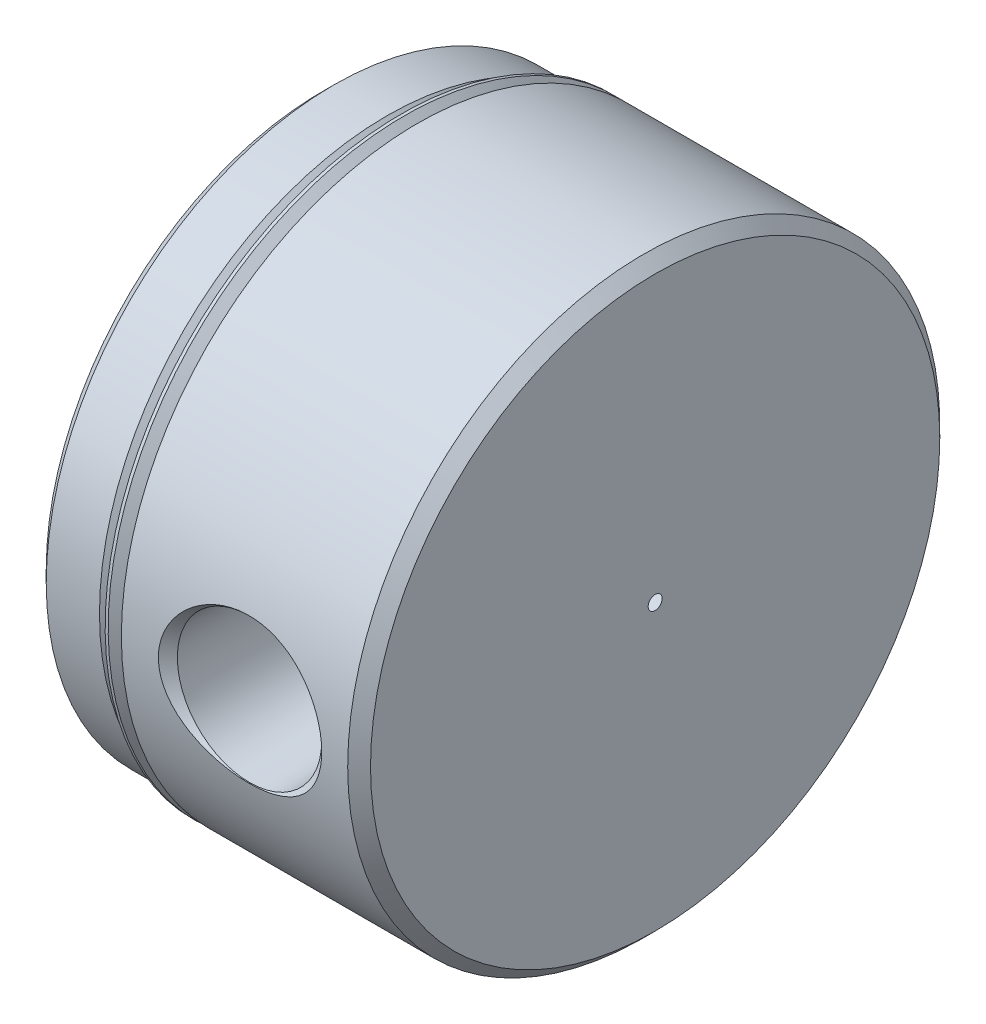
ISO-10303-21;
HEADER;
FILE_DESCRIPTION(('STEP AP214'),'2;1');
FILE_NAME('part.step','',(''),(''),'','','');
FILE_SCHEMA(('AUTOMOTIVE_DESIGN { 1 0 10303 214 1 1 1 1 }'));
ENDSEC;
DATA;
#1=APPLICATION_CONTEXT('core data for automotive mechanical design processes');
#2=APPLICATION_PROTOCOL_DEFINITION('international standard','automotive_design',2000,#1);
#3=PRODUCT_CONTEXT('',#1,'mechanical');
#4=PRODUCT('Part','Part','',(#3));
#5=PRODUCT_RELATED_PRODUCT_CATEGORY('part','',(#4));
#6=PRODUCT_DEFINITION_FORMATION('','',#4);
#7=PRODUCT_DEFINITION_CONTEXT('part definition',#1,'design');
#8=PRODUCT_DEFINITION('design','',#6,#7);
#9=PRODUCT_DEFINITION_SHAPE('','',#8);
#10=(LENGTH_UNIT() NAMED_UNIT(*) SI_UNIT(.MILLI.,.METRE.));
#11=(NAMED_UNIT(*) PLANE_ANGLE_UNIT() SI_UNIT($,.RADIAN.));
#12=(NAMED_UNIT(*) SI_UNIT($,.STERADIAN.) SOLID_ANGLE_UNIT());
#13=UNCERTAINTY_MEASURE_WITH_UNIT(LENGTH_MEASURE(1.E-05),#10,'distance_accuracy_value','');
#14=(GEOMETRIC_REPRESENTATION_CONTEXT(3) GLOBAL_UNCERTAINTY_ASSIGNED_CONTEXT((#13)) GLOBAL_UNIT_ASSIGNED_CONTEXT((#10,
#11,#12)) REPRESENTATION_CONTEXT('',''));
#15=CARTESIAN_POINT('',(0.,0.,0.));
#16=DIRECTION('',(0.,0.,1.));
#17=DIRECTION('',(1.,0.,0.));
#18=AXIS2_PLACEMENT_3D('',#15,#16,#17);
#19=CARTESIAN_POINT('',(22.225,0.,0.));
#20=DIRECTION('',(-1.,0.,0.));
#21=DIRECTION('',(0.,0.,1.));
#22=AXIS2_PLACEMENT_3D('',#19,#20,#21);
#23=CYLINDRICAL_SURFACE('',#22,18.18005);
#24=CARTESIAN_POINT('',(5.334,0.,0.));
#25=DIRECTION('',(-1.,0.,0.));
#26=DIRECTION('',(0.,0.,1.));
#27=AXIS2_PLACEMENT_3D('',#24,#25,#26);
#28=CIRCLE('',#27,18.18005);
#29=CARTESIAN_POINT('',(5.334,0.,18.18005));
#30=VERTEX_POINT('',#29);
#31=EDGE_CURVE('E91',#30,#30,#28,.T.);
#32=ORIENTED_EDGE('',*,*,#31,.F.);
#33=EDGE_LOOP('',(#32));
#34=FACE_BOUND('',#33,.T.);
#35=CARTESIAN_POINT('',(5.84200000000007,0.,0.));
#36=DIRECTION('',(1.,0.,0.));
#37=DIRECTION('',(0.,1.,0.));
#38=AXIS2_PLACEMENT_3D('',#35,#36,#37);
#39=CIRCLE('',#38,18.18005);
#40=CARTESIAN_POINT('',(5.84199999999987,18.1800500000001,0.));
#41=VERTEX_POINT('',#40);
#42=EDGE_CURVE('E11',#41,#41,#39,.T.);
#43=ORIENTED_EDGE('',*,*,#42,.F.);
#44=EDGE_LOOP('',(#43));
#45=FACE_BOUND('',#44,.T.);
#46=ADVANCED_FACE('F40',(#34,#45),#23,.T.);
#47=CARTESIAN_POINT('',(6.35,18.18005,0.));
#48=DIRECTION('',(1.,0.,0.));
#49=DIRECTION('',(0.,0.,-1.));
#50=AXIS2_PLACEMENT_3D('',#47,#48,#49);
#51=PLANE('',#50);
#52=CARTESIAN_POINT('',(6.35,0.,0.));
#53=DIRECTION('',(-1.,0.,0.));
#54=DIRECTION('',(0.,0.,1.));
#55=AXIS2_PLACEMENT_3D('',#52,#53,#54);
#56=CIRCLE('',#55,19.76755);
#57=CARTESIAN_POINT('',(6.35,0.,19.76755));
#58=VERTEX_POINT('',#57);
#59=EDGE_CURVE('E88',#58,#58,#56,.T.);
#60=ORIENTED_EDGE('',*,*,#59,.T.);
#61=EDGE_LOOP('',(#60));
#62=FACE_BOUND('',#61,.T.);
#63=CARTESIAN_POINT('',(6.35,0.,-2.09701802314513E-13));
#64=DIRECTION('',(1.,0.,0.));
#65=DIRECTION('',(0.,0.,-1.));
#66=AXIS2_PLACEMENT_3D('',#63,#64,#65);
#67=CIRCLE('',#66,18.8882591752451);
#68=CARTESIAN_POINT('',(6.35,0.,-18.8882591752453));
#69=VERTEX_POINT('',#68);
#70=EDGE_CURVE('E48',#69,#69,#67,.F.);
#71=ORIENTED_EDGE('',*,*,#70,.F.);
#72=EDGE_LOOP('',(#71));
#73=FACE_BOUND('',#72,.T.);
#74=ADVANCED_FACE('F162',(#62,#73),#51,.F.);
#75=CARTESIAN_POINT('',(0.,0.,0.));
#76=DIRECTION('',(-1.,0.,0.));
#77=DIRECTION('',(0.,0.,1.));
#78=AXIS2_PLACEMENT_3D('',#75,#76,#77);
#79=CYLINDRICAL_SURFACE('',#78,6.7564);
#80=CARTESIAN_POINT('',(18.5928000000002,-1.55016936318018,6.57616270369412));
#81=CARTESIAN_POINT('',(18.5480783546021,-1.67477017407394,6.54681110042799));
#82=CARTESIAN_POINT('',(18.4982069019602,-1.79670416096938,6.51431130142337));
#83=CARTESIAN_POINT('',(18.3889398911797,-2.034471868403,6.44400086646078));
#84=CARTESIAN_POINT('',(18.3295545154926,-2.15031193694006,6.40619591374911));
#85=CARTESIAN_POINT('',(18.2022291765273,-2.37487755976104,6.32637743122827));
#86=CARTESIAN_POINT('',(18.1343296276472,-2.48363326109138,6.28438396405489));
#87=CARTESIAN_POINT('',(17.9904073482674,-2.69419408425629,6.19703694181793));
#88=CARTESIAN_POINT('',(17.9143824575952,-2.79599734589265,6.15168249420449));
#89=CARTESIAN_POINT('',(17.6756516881527,-3.08962890373542,6.01247195430659));
#90=CARTESIAN_POINT('',(17.5016575906913,-3.27078021296364,5.91506016042606));
#91=CARTESIAN_POINT('',(17.1266794554601,-3.60246884588408,5.71912272723389));
#92=CARTESIAN_POINT('',(16.925648520464,-3.75295180614472,5.62059543122973));
#93=CARTESIAN_POINT('',(16.5170575522464,-4.00917287001961,5.44038937728638));
#94=CARTESIAN_POINT('',(16.3115382567099,-4.11764256855379,5.35799033818033));
#95=CARTESIAN_POINT('',(15.8815253629173,-4.30362633415061,5.20979058670521));
#96=CARTESIAN_POINT('',(15.6570736802124,-4.38120671660834,5.14395442913646));
#97=CARTESIAN_POINT('',(15.2384723544777,-4.48960836666032,5.04940736413939));
#98=CARTESIAN_POINT('',(15.0470252632443,-4.52661952298427,5.01594531152541));
#99=CARTESIAN_POINT('',(14.6585033498917,-4.57593097078118,4.97101309444454));
#100=CARTESIAN_POINT('',(14.4614353487014,-4.58826001958046,4.95951733757795));
#101=CARTESIAN_POINT('',(14.0671575987921,-4.5873682960647,4.9603419785027));
#102=CARTESIAN_POINT('',(13.8699479902141,-4.57411489152293,4.97269279428765));
#103=CARTESIAN_POINT('',(13.481314727699,-4.5229497040564,5.01926294086608));
#104=CARTESIAN_POINT('',(13.2898991557438,-4.48500500139721,5.05351146577056));
#105=CARTESIAN_POINT('',(12.8694089990069,-4.37397590414582,5.15013858421322));
#106=CARTESIAN_POINT('',(12.6432173725713,-4.29438795650013,5.21747027846388));
#107=CARTESIAN_POINT('',(12.2103737994155,-4.10395208742262,5.36854163197956));
#108=CARTESIAN_POINT('',(12.0037506235077,-3.99305906365896,5.45230491129153));
#109=CARTESIAN_POINT('',(11.6078690502403,-3.74056673260752,5.62861592264111));
#110=CARTESIAN_POINT('',(11.4190397789097,-3.5983984964746,5.72130566468947));
#111=CARTESIAN_POINT('',(11.0650148013139,-3.28649474473922,5.90599018926294));
#112=CARTESIAN_POINT('',(10.8998284149905,-3.11674841393698,5.99798468426317));
#113=CARTESIAN_POINT('',(10.6590781037533,-2.82736759192116,6.13751100490684));
#114=CARTESIAN_POINT('',(10.5747637703954,-2.71615917843616,6.18765532662777));
#115=CARTESIAN_POINT('',(10.4159373046059,-2.48534476456429,6.28391717198707));
#116=CARTESIAN_POINT('',(10.3414208431729,-2.36574250890419,6.33003647095517));
#117=CARTESIAN_POINT('',(10.203089686097,-2.11880193024189,6.41690924360146));
#118=CARTESIAN_POINT('',(10.1392642692946,-1.99147153389607,6.45766808391518));
#119=CARTESIAN_POINT('',(10.0231886128704,-1.72986685829916,6.5326130675245));
#120=CARTESIAN_POINT('',(9.97093371528921,-1.5955954002702,6.56680185499996));
#121=CARTESIAN_POINT('',(9.85653287360742,-1.25429314337887,6.64222801271814));
#122=CARTESIAN_POINT('',(9.80191452573611,-1.04360474104496,6.67882070242641));
#123=CARTESIAN_POINT('',(9.72305551227294,-0.614300653156337,6.73188821156131));
#124=CARTESIAN_POINT('',(9.69879054988074,-0.395691452347844,6.74837912147382));
#125=CARTESIAN_POINT('',(9.68191036515892,0.0437172497495764,6.75983608394331));
#126=CARTESIAN_POINT('',(9.68934887987925,0.264519836488323,6.75476559018812));
#127=CARTESIAN_POINT('',(9.73557020819385,0.701293032369471,6.72347499875372));
#128=CARTESIAN_POINT('',(9.77436235112002,0.917262183654551,6.69724860610096));
#129=CARTESIAN_POINT('',(9.88020681646112,1.3346340565651,6.62659243989054));
#130=CARTESIAN_POINT('',(9.94673313635791,1.53623008207218,6.5825018917664));
#131=CARTESIAN_POINT('',(10.1051010047477,1.92506615557765,6.47947315861717));
#132=CARTESIAN_POINT('',(10.196947371199,2.1123034626896,6.42053214799483));
#133=CARTESIAN_POINT('',(10.4146617279391,2.49002673443004,6.28437947384145));
#134=CARTESIAN_POINT('',(10.5431998940954,2.67849332151466,6.20585639742187));
#135=CARTESIAN_POINT('',(10.8246521487988,3.03246917966281,6.04080320131233));
#136=CARTESIAN_POINT('',(10.9775944415059,3.19795146844978,5.95426386627355));
#137=CARTESIAN_POINT('',(11.333106600818,3.53036100364397,5.76437277869107));
#138=CARTESIAN_POINT('',(11.5396951051159,3.69279989815421,5.66065279573348));
#139=CARTESIAN_POINT('',(11.9803196741159,3.98156448888008,5.46139266085853));
#140=CARTESIAN_POINT('',(12.2143404876726,4.10791011831174,5.36584801445409));
#141=CARTESIAN_POINT('',(12.6490198095501,4.29496946517335,5.21660723679697));
#142=CARTESIAN_POINT('',(12.8444067120639,4.36414371087455,5.15836116778382));
#143=CARTESIAN_POINT('',(13.1463316164498,4.44810420733218,5.08573184568603));
#144=CARTESIAN_POINT('',(13.2484115175242,4.47278591721943,5.0639835421401));
#145=CARTESIAN_POINT('',(13.455017349472,4.51521988935389,5.02618570643374));
#146=CARTESIAN_POINT('',(13.5595421189191,4.53297537375789,5.0101335246891));
#147=CARTESIAN_POINT('',(13.7712614652903,4.56137080114024,4.98429650223126));
#148=CARTESIAN_POINT('',(13.8784712968326,4.57194802438945,4.97456693557593));
#149=CARTESIAN_POINT('',(14.0937773748546,4.58552224102421,4.962057349779));
#150=CARTESIAN_POINT('',(14.2018736035466,4.58851938615075,4.95927719152142));
#151=CARTESIAN_POINT('',(14.4179653491538,4.58686413211966,4.96080855068768));
#152=CARTESIAN_POINT('',(14.5259608623642,4.58221146187516,4.96512031942846));
#153=CARTESIAN_POINT('',(14.7408333300755,4.56536902193393,4.98060917338988));
#154=CARTESIAN_POINT('',(14.8477103080235,4.55317941055325,4.99178611440517));
#155=CARTESIAN_POINT('',(15.1414427378729,4.50921890331316,5.03163728551847));
#156=CARTESIAN_POINT('',(15.3262684011186,4.46959539823073,5.06715835071849));
#157=CARTESIAN_POINT('',(15.6861438196852,4.3693611265816,5.15383041312067));
#158=CARTESIAN_POINT('',(15.8611850862263,4.3087324546845,5.20499474064512));
#159=CARTESIAN_POINT('',(16.2766177177026,4.13663647367069,5.34361142089924));
#160=CARTESIAN_POINT('',(16.5107152551665,4.01457982160109,5.43700530907841));
#161=CARTESIAN_POINT('',(16.8415985788416,3.80484458098162,5.58385906950328));
#162=CARTESIAN_POINT('',(16.9486632835243,3.73035735844849,5.63401899340193));
#163=CARTESIAN_POINT('',(17.1558588255965,3.57275407296689,5.73525219091774));
#164=CARTESIAN_POINT('',(17.2559896169989,3.48963795279895,5.78632547058964));
#165=CARTESIAN_POINT('',(17.4503722557073,3.31380848354943,5.88881405431605));
#166=CARTESIAN_POINT('',(17.5445148551956,3.22097105381821,5.94022319261113));
#167=CARTESIAN_POINT('',(17.7248440795816,3.02702351069218,6.04135966453211));
#168=CARTESIAN_POINT('',(17.8110315032645,2.92591422980757,6.09108716669397));
#169=CARTESIAN_POINT('',(17.974654019678,2.71604134290332,6.18751622593653));
#170=CARTESIAN_POINT('',(18.0521145835485,2.60730159964489,6.2342264099378));
#171=CARTESIAN_POINT('',(18.1978726987711,2.38235088658262,6.32360508740653));
#172=CARTESIAN_POINT('',(18.2661756988058,2.26614442086133,6.36627597973957));
#173=CARTESIAN_POINT('',(18.3799371716984,2.05124405465741,6.43827748366877));
#174=CARTESIAN_POINT('',(18.4272114716545,1.95382525506465,6.46855213567405));
#175=CARTESIAN_POINT('',(18.515104738232,1.75493610892246,6.52532538436022));
#176=CARTESIAN_POINT('',(18.5557217160893,1.65346456290052,6.55182285236351));
#177=CARTESIAN_POINT('',(18.5928000000002,1.55016936318018,6.57616270369412));
#178=B_SPLINE_CURVE_WITH_KNOTS('',3,(#80,#81,#82,#83,#84,#85,#86,#87,#88,#89,#90,#91,#92,#93,
#94,#95,#96,#97,#98,#99,#100,#101,#102,#103,#104,#105,#106,#107,#108,#109,#110,#111,#112,#113,
#114,#115,#116,#117,#118,#119,#120,#121,#122,#123,#124,#125,#126,#127,#128,#129,#130,#131,#132,
#133,#134,#135,#136,#137,#138,#139,#140,#141,#142,#143,#144,#145,#146,#147,#148,#149,#150,#151,
#152,#153,#154,#155,#156,#157,#158,#159,#160,#161,#162,#163,#164,#165,#166,#167,#168,#169,#170,
#171,#172,#173,#174,#175,#176,#177),.UNSPECIFIED.,.F.,.F.,(4,2,2,2,2,2,2,2,2,2,2,2,2,2,2,2,2,2,
2,2,2,2,2,2,2,2,2,2,2,2,2,2,2,2,2,2,2,2,2,2,2,2,2,2,2,2,2,2,4),(0.,0.406531883953459,
0.812631541178495,1.21687176653168,1.62121973025145,2.42596058945675,3.23211577584758,
3.96909059283908,4.70447457624651,5.29547863989841,5.88579371817516,6.47686228266218,
7.06872050987505,7.81188878965482,8.55613329115958,9.31523889960314,10.074642925488,
10.5189952834116,10.9631506483034,11.4068579049927,11.85038621179,12.5093851821333,
13.1678563090951,13.8274439809421,14.4872279866437,15.1350302132074,15.7829557902936,
16.5040246526004,17.2259329810846,18.0699260655888,18.9134521331922,19.5566958857053,
19.878101591881,20.1993575977378,20.5233856201742,20.8474071560389,21.1714401745179,
21.4954663868024,22.0699308600511,22.6448862309692,23.480156825702,23.8990691564028,
24.3179842651494,24.7431138458205,25.1682006923651,25.592012803124,26.0155716190208,
26.3525601330265,26.6896491339696),.UNSPECIFIED.);
#179=CARTESIAN_POINT('',(18.5928000000002,-1.55016936318018,6.57616270369412));
#180=VERTEX_POINT('',#179);
#181=CARTESIAN_POINT('',(18.5928000000002,1.55016936318018,6.57616270369412));
#182=VERTEX_POINT('',#181);
#183=EDGE_CURVE('E56',#180,#182,#178,.T.);
#184=ORIENTED_EDGE('',*,*,#183,.F.);
#185=CARTESIAN_POINT('',(18.5928000000002,0.,0.));
#186=DIRECTION('',(-1.,0.,0.));
#187=DIRECTION('',(0.,0.,1.));
#188=AXIS2_PLACEMENT_3D('',#185,#186,#187);
#189=CIRCLE('',#188,6.7564);
#190=EDGE_CURVE('E66',#182,#180,#189,.T.);
#191=ORIENTED_EDGE('',*,*,#190,.F.);
#192=EDGE_LOOP('',(#184,#191));
#193=FACE_BOUND('',#192,.T.);
#194=CARTESIAN_POINT('',(6.35,0.,0.));
#195=DIRECTION('',(-1.,0.,0.));
#196=DIRECTION('',(0.,0.,1.));
#197=AXIS2_PLACEMENT_3D('',#194,#195,#196);
#198=CIRCLE('',#197,6.7564);
#199=CARTESIAN_POINT('',(6.35,0.,6.7564));
#200=VERTEX_POINT('',#199);
#201=EDGE_CURVE('E201',#200,#200,#198,.F.);
#202=ORIENTED_EDGE('',*,*,#201,.F.);
#203=EDGE_LOOP('',(#202));
#204=FACE_BOUND('',#203,.T.);
#205=ADVANCED_FACE('F69',(#193,#204),#79,.F.);
#206=CARTESIAN_POINT('',(0.,0.,0.));
#207=DIRECTION('',(1.,0.,0.));
#208=DIRECTION('',(0.,0.,-1.));
#209=AXIS2_PLACEMENT_3D('',#206,#207,#208);
#210=PLANE('',#209);
#211=CARTESIAN_POINT('',(0.,0.,0.));
#212=DIRECTION('',(-1.,0.,0.));
#213=DIRECTION('',(0.,0.,1.));
#214=AXIS2_PLACEMENT_3D('',#211,#212,#213);
#215=CIRCLE('',#214,18.43405);
#216=CARTESIAN_POINT('',(0.,0.,18.43405));
#217=VERTEX_POINT('',#216);
#218=EDGE_CURVE('E62',#217,#217,#215,.T.);
#219=ORIENTED_EDGE('',*,*,#218,.T.);
#220=EDGE_LOOP('',(#219));
#221=FACE_BOUND('',#220,.T.);
#222=CARTESIAN_POINT('',(0.,0.,0.));
#223=DIRECTION('',(-1.,0.,0.));
#224=DIRECTION('',(0.,0.,1.));
#225=AXIS2_PLACEMENT_3D('',#222,#223,#224);
#226=CIRCLE('',#225,12.3063);
#227=CARTESIAN_POINT('',(0.,0.,12.3063));
#228=VERTEX_POINT('',#227);
#229=EDGE_CURVE('E200',#228,#228,#226,.T.);
#230=ORIENTED_EDGE('',*,*,#229,.F.);
#231=EDGE_LOOP('',(#230));
#232=FACE_BOUND('',#231,.T.);
#233=ADVANCED_FACE('F42',(#221,#232),#210,.F.);
#234=CARTESIAN_POINT('',(22.225,0.,0.));
#235=DIRECTION('',(-1.,0.,0.));
#236=DIRECTION('',(0.,0.,1.));
#237=AXIS2_PLACEMENT_3D('',#234,#235,#236);
#238=CYLINDRICAL_SURFACE('',#237,19.76755);
#239=ORIENTED_EDGE('',*,*,#59,.F.);
#240=EDGE_LOOP('',(#239));
#241=FACE_BOUND('',#240,.T.);
#242=CARTESIAN_POINT('',(21.463,0.,0.));
#243=DIRECTION('',(-1.,0.,0.));
#244=DIRECTION('',(0.,0.,1.));
#245=AXIS2_PLACEMENT_3D('',#242,#243,#244);
#246=CIRCLE('',#245,19.76755);
#247=CARTESIAN_POINT('',(21.463,0.,19.76755));
#248=VERTEX_POINT('',#247);
#249=EDGE_CURVE('E85',#248,#248,#246,.T.);
#250=ORIENTED_EDGE('',*,*,#249,.T.);
#251=EDGE_LOOP('',(#250));
#252=FACE_BOUND('',#251,.T.);
#253=CARTESIAN_POINT('',(10.5869647765276,-3.56645171001473,19.4431595992687));
#254=CARTESIAN_POINT('',(10.8282227807219,-3.7638255387725,19.4069576975588));
#255=CARTESIAN_POINT('',(11.0871309553769,-3.94016323565768,19.3715185655114));
#256=CARTESIAN_POINT('',(11.631396555371,-4.24787278029809,19.3063846696766));
#257=CARTESIAN_POINT('',(11.9168019841216,-4.3791609121415,19.2767006446753));
#258=CARTESIAN_POINT('',(12.5068071757778,-4.59509779678872,19.2263747275949));
#259=CARTESIAN_POINT('',(12.8114794292612,-4.67955710237012,19.2057696325378));
#260=CARTESIAN_POINT('',(13.430663565497,-4.79973110944294,19.1760910180489));
#261=CARTESIAN_POINT('',(13.7451714914687,-4.83546516095738,19.167012921055));
#262=CARTESIAN_POINT('',(14.3898796843586,-4.85819323220641,19.161268076107));
#263=CARTESIAN_POINT('',(14.7201648176798,-4.84298785768909,19.1651613495261));
#264=CARTESIAN_POINT('',(15.3735503680904,-4.75918195043114,19.1861419785606));
#265=CARTESIAN_POINT('',(15.6966487974919,-4.69056683002417,19.2032329388161));
#266=CARTESIAN_POINT('',(16.3274427247266,-4.50071405121191,19.2486134091166));
#267=CARTESIAN_POINT('',(16.6350812323984,-4.37929564882178,19.2769413534785));
#268=CARTESIAN_POINT('',(17.2243623702993,-4.08563895581904,19.3413058120148));
#269=CARTESIAN_POINT('',(17.5060022071553,-3.91339521270717,19.3773431531325));
#270=CARTESIAN_POINT('',(18.0254560824385,-3.52663541060897,19.4513848486353));
#271=CARTESIAN_POINT('',(18.2643186805735,-3.31351781411044,19.4892996948606));
#272=CARTESIAN_POINT('',(18.6979728314553,-2.84600441757952,19.5630295327933));
#273=CARTESIAN_POINT('',(18.8927965933684,-2.59163902077585,19.5988460448858));
#274=CARTESIAN_POINT('',(19.211338904,-2.07449390956125,19.6599380331672));
#275=CARTESIAN_POINT('',(19.3401505739116,-1.81497447153852,19.6859021100914));
#276=CARTESIAN_POINT('',(19.4941914940661,-1.41063030235951,19.7176207484786));
#277=CARTESIAN_POINT('',(19.5390100576124,-1.27333221589715,19.7269892813154));
#278=CARTESIAN_POINT('',(19.6149389595911,-0.994853334857038,19.742992556994));
#279=CARTESIAN_POINT('',(19.6460512817009,-0.853673105278505,19.7496276954256));
#280=CARTESIAN_POINT('',(19.7115580476174,-0.463841558153077,19.7636487691392));
#281=CARTESIAN_POINT('',(19.7315483262046,-0.212488991545308,19.7680001913194));
#282=CARTESIAN_POINT('',(19.7270317154293,0.289608468958132,19.7670245909796));
#283=CARTESIAN_POINT('',(19.7025400879358,0.540353541730723,19.7617008880222));
#284=CARTESIAN_POINT('',(19.6133993596323,1.01844302834036,19.7426595968894));
#285=CARTESIAN_POINT('',(19.5512708090036,1.24628517044557,19.7294696135882));
#286=CARTESIAN_POINT('',(19.3920706149329,1.68884238989575,19.6965263566318));
#287=CARTESIAN_POINT('',(19.294994030156,1.903555605905,19.676772154886));
#288=CARTESIAN_POINT('',(19.0641629624218,2.32581362063585,19.6314544849768));
#289=CARTESIAN_POINT('',(18.9288081435989,2.53245348119671,19.6056486414989));
#290=CARTESIAN_POINT('',(18.6288474284322,2.9228150216871,19.5512687249584));
#291=CARTESIAN_POINT('',(18.4642294197302,3.10652715777825,19.5226935078575));
#292=CARTESIAN_POINT('',(18.0900253646671,3.46845045544958,19.4618446577912));
#293=CARTESIAN_POINT('',(17.8774378893636,3.6435497924149,19.4295266191188));
#294=CARTESIAN_POINT('',(17.4280878867151,3.95990350267997,19.3675303574784));
#295=CARTESIAN_POINT('',(17.1913137941605,4.10114157563128,19.3378534102005));
#296=CARTESIAN_POINT('',(16.6714964556106,4.36216159862035,19.2807542174228));
#297=CARTESIAN_POINT('',(16.3862493356942,4.47770694089377,19.253967141721));
#298=CARTESIAN_POINT('',(15.8006185707482,4.66328399286398,19.2098654388842));
#299=CARTESIAN_POINT('',(15.500230546772,4.73330245326301,19.1925535694688));
#300=CARTESIAN_POINT('',(14.8734101009269,4.82964105389312,19.1685499454754));
#301=CARTESIAN_POINT('',(14.5465011599297,4.85306282472645,19.1625636680598));
#302=CARTESIAN_POINT('',(13.8931715456606,4.84716182330062,19.1640559817553));
#303=CARTESIAN_POINT('',(13.5667509448002,4.81783188096735,19.1715364032759));
#304=CARTESIAN_POINT('',(12.9190590054788,4.70615116269027,19.1992582097509));
#305=CARTESIAN_POINT('',(12.5979175100091,4.62308682148939,19.2196712568968));
#306=CARTESIAN_POINT('',(11.9747382691916,4.40456844893322,19.2709194418203));
#307=CARTESIAN_POINT('',(11.6727038149128,4.2691054206632,19.3017563692753));
#308=CARTESIAN_POINT('',(11.101348936119,3.95010958394954,19.3695332877315));
#309=CARTESIAN_POINT('',(10.8316345876413,3.76726591436041,19.4063831867828));
#310=CARTESIAN_POINT('',(10.3300037092924,3.35556599404743,19.4817820788438));
#311=CARTESIAN_POINT('',(10.0980760234984,3.12672336852935,19.5203305660862));
#312=CARTESIAN_POINT('',(9.6975427338429,2.64545260848221,19.5911312844319));
#313=CARTESIAN_POINT('',(9.52561865776955,2.39583746716226,19.6236360012175));
#314=CARTESIAN_POINT('',(9.23308109229848,1.86737470933411,19.6809331370018));
#315=CARTESIAN_POINT('',(9.11240148990457,1.58856534053445,19.7057354820326));
#316=CARTESIAN_POINT('',(8.94224507943257,1.04907557631405,19.7412970513721));
#317=CARTESIAN_POINT('',(8.88554228464741,0.79076274906609,19.7534644586095));
#318=CARTESIAN_POINT('',(8.82046206297552,0.267893228465032,19.7674588586931));
#319=CARTESIAN_POINT('',(8.81205000495521,0.00334114626716176,19.7692932617138));
#320=CARTESIAN_POINT('',(8.84244539182385,-0.49699443350643,19.762732354863));
#321=CARTESIAN_POINT('',(8.87675278879281,-0.733079854752256,19.7553118301189));
#322=CARTESIAN_POINT('',(8.98331302234027,-1.19613809237271,19.7326895137283));
#323=CARTESIAN_POINT('',(9.05557345224739,-1.42310907542052,19.7174861649743));
#324=CARTESIAN_POINT('',(9.23575819587777,-1.8649912190355,19.6806424449135));
#325=CARTESIAN_POINT('',(9.344107092386,-2.07972134351335,19.6589257620959));
#326=CARTESIAN_POINT('',(9.59181685671267,-2.48973079662372,19.6112186119232));
#327=CARTESIAN_POINT('',(9.73116238621492,-2.68501967657776,19.5852302600078));
#328=CARTESIAN_POINT('',(9.98921350609093,-2.99646065670766,19.5395464783173));
#329=CARTESIAN_POINT('',(10.1010637932931,-3.11846508436446,19.5203772234222));
#330=CARTESIAN_POINT('',(10.3359417238184,-3.35110384342693,19.4817869463761));
#331=CARTESIAN_POINT('',(10.4589692892291,-3.46173825407706,19.4623659259809));
#332=CARTESIAN_POINT('',(10.5869647765276,-3.56645171001473,19.4431595992687));
#333=B_SPLINE_CURVE_WITH_KNOTS('',3,(#253,#254,#255,#256,#257,#258,#259,#260,#261,#262,#263,
#264,#265,#266,#267,#268,#269,#270,#271,#272,#273,#274,#275,#276,#277,#278,#279,#280,#281,#282,
#283,#284,#285,#286,#287,#288,#289,#290,#291,#292,#293,#294,#295,#296,#297,#298,#299,#300,#301,
#302,#303,#304,#305,#306,#307,#308,#309,#310,#311,#312,#313,#314,#315,#316,#317,#318,#319,#320,
#321,#322,#323,#324,#325,#326,#327,#328,#329,#330,#331,#332),.UNSPECIFIED.,.T.,.F.,(4,2,2,2,2,2,
2,2,2,2,2,2,2,2,2,2,2,2,2,2,2,2,2,2,2,2,2,2,2,2,2,2,2,2,2,2,2,2,2,4),(0.,0.940790642011342,
1.88332021183009,2.82963549475929,3.77557486254736,4.76287392087108,5.75044273230372,
6.74141890081162,7.73250141907354,8.69431801029597,9.65542885456442,10.5224705165865,
10.9560264412447,11.3895195975774,12.141720787344,12.8936639434869,13.6000905171265,
14.3066170123269,15.0487093621908,15.7911095905454,16.6196541764434,17.4485968150801,
18.3713434275553,19.294358459009,20.273186457939,21.252147510362,22.2443831950913,
23.2367893235053,24.215500662844,25.1939225272553,26.1031414590371,27.0111837726312,
27.8009727606978,28.5901952900622,29.3028821875706,30.0157117279193,30.7372428067124,
31.4584176355388,31.9575421988581,32.4566632832433),.UNSPECIFIED.);
#334=CARTESIAN_POINT('',(10.5869647765276,-3.56645171001473,19.4431595992687));
#335=VERTEX_POINT('',#334);
#336=EDGE_CURVE('E61',#335,#335,#333,.T.);
#337=ORIENTED_EDGE('',*,*,#336,.F.);
#338=EDGE_LOOP('',(#337));
#339=FACE_BOUND('',#338,.T.);
#340=ADVANCED_FACE('F187',(#241,#252,#339),#238,.T.);
#341=CARTESIAN_POINT('',(18.5928000000002,0.,0.));
#342=DIRECTION('',(-1.,0.,0.));
#343=DIRECTION('',(0.,0.,1.));
#344=AXIS2_PLACEMENT_3D('',#341,#342,#343);
#345=CONICAL_SURFACE('',#344,6.7564,1.0471975511966);
#346=CARTESIAN_POINT('',(22.225,0.,0.));
#347=DIRECTION('',(-1.,0.,0.));
#348=DIRECTION('',(0.,0.,1.));
#349=AXIS2_PLACEMENT_3D('',#346,#347,#348);
#350=CIRCLE('',#349,0.465245056748708);
#351=CARTESIAN_POINT('',(22.225,0.,0.465245056748708));
#352=VERTEX_POINT('',#351);
#353=EDGE_CURVE('E71',#352,#352,#350,.T.);
#354=ORIENTED_EDGE('',*,*,#353,.F.);
#355=EDGE_LOOP('',(#354));
#356=FACE_BOUND('',#355,.T.);
#357=CARTESIAN_POINT('',(18.5656173820367,1.62389508545216,6.60683946065638));
#358=CARTESIAN_POINT('',(18.5958228950293,1.54412641977245,6.5725761621014));
#359=CARTESIAN_POINT('',(18.6241610796621,1.46248512650449,6.54100458598942));
#360=CARTESIAN_POINT('',(18.6766403297962,1.29596916999979,6.48335578292517));
#361=CARTESIAN_POINT('',(18.7007809721662,1.21109418184206,6.45727910982793));
#362=CARTESIAN_POINT('',(18.7443572486332,1.03879381418819,6.41077974622233));
#363=CARTESIAN_POINT('',(18.763801252178,0.951373287189314,6.39034698874039));
#364=CARTESIAN_POINT('',(18.797680128004,0.774485978703613,6.3550888531611));
#365=CARTESIAN_POINT('',(18.8121153676485,0.685019347799726,6.34026306381844));
#366=CARTESIAN_POINT('',(18.8475062787223,0.414207282420917,6.30411829445546));
#367=CARTESIAN_POINT('',(18.8605157698737,0.230571937660291,6.29116441991466));
#368=CARTESIAN_POINT('',(18.8642612618991,-0.137176775771358,6.28740684468006));
#369=CARTESIAN_POINT('',(18.8549932141882,-0.321290225256233,6.29660717015682));
#370=CARTESIAN_POINT('',(18.8241555226637,-0.601125218203682,6.32794564529671));
#371=CARTESIAN_POINT('',(18.8101724052564,-0.698677846958573,6.34221985280942));
#372=CARTESIAN_POINT('',(18.7762244094556,-0.891573561757308,6.37735541362983));
#373=CARTESIAN_POINT('',(18.7562585132283,-0.986916268857359,6.3982178878139));
#374=CARTESIAN_POINT('',(18.7107196666269,-1.17478737481961,6.4465900398927));
#375=CARTESIAN_POINT('',(18.6851325918205,-1.26730800343918,6.47411648054567));
#376=CARTESIAN_POINT('',(18.6289701187035,-1.44858751079791,6.53565059523493));
#377=CARTESIAN_POINT('',(18.5983955645836,-1.53734702295377,6.56965717259385));
#378=CARTESIAN_POINT('',(18.5656173820367,-1.62389508545216,6.60683946065638));
#379=B_SPLINE_CURVE_WITH_KNOTS('',3,(#357,#358,#359,#360,#361,#362,#363,#364,#365,#366,#367,
#368,#369,#370,#371,#372,#373,#374,#375,#376,#377,#378),.UNSPECIFIED.,.F.,.F.,(4,2,2,2,2,2,2,2,
2,2,4),(0.,0.275696279901654,0.551420335145524,0.826649361848343,1.10185819785165,
1.65266182667928,2.20356556278768,2.50193569647357,2.8003566199024,3.09953614641758,
3.39866508565303),.UNSPECIFIED.);
#380=EDGE_CURVE('E54',#182,#180,#379,.T.);
#381=ORIENTED_EDGE('',*,*,#380,.F.);
#382=ORIENTED_EDGE('',*,*,#190,.T.);
#383=EDGE_LOOP('',(#381,#382));
#384=FACE_BOUND('',#383,.T.);
#385=ADVANCED_FACE('F65',(#356,#384),#345,.F.);
#386=CARTESIAN_POINT('',(0.761999999999999,0.,0.));
#387=DIRECTION('',(1.,0.,0.));
#388=DIRECTION('',(0.,0.,-1.));
#389=AXIS2_PLACEMENT_3D('',#386,#387,#388);
#390=CONICAL_SURFACE('',#389,19.19605,0.785398163397448);
#391=ORIENTED_EDGE('',*,*,#218,.F.);
#392=EDGE_LOOP('',(#391));
#393=FACE_BOUND('',#392,.T.);
#394=CARTESIAN_POINT('',(0.761999999999999,0.,0.));
#395=DIRECTION('',(-1.,0.,0.));
#396=DIRECTION('',(0.,0.,1.));
#397=AXIS2_PLACEMENT_3D('',#394,#395,#396);
#398=CIRCLE('',#397,19.19605);
#399=CARTESIAN_POINT('',(0.761999999999999,0.,19.19605));
#400=VERTEX_POINT('',#399);
#401=EDGE_CURVE('E97',#400,#400,#398,.T.);
#402=ORIENTED_EDGE('',*,*,#401,.T.);
#403=EDGE_LOOP('',(#402));
#404=FACE_BOUND('',#403,.T.);
#405=ADVANCED_FACE('F180',(#393,#404),#390,.T.);
#406=CARTESIAN_POINT('',(22.225,0.,0.));
#407=DIRECTION('',(-1.,0.,0.));
#408=DIRECTION('',(0.,0.,1.));
#409=AXIS2_PLACEMENT_3D('',#406,#407,#408);
#410=CYLINDRICAL_SURFACE('',#409,19.19605);
#411=ORIENTED_EDGE('',*,*,#401,.F.);
#412=EDGE_LOOP('',(#411));
#413=FACE_BOUND('',#412,.T.);
#414=CARTESIAN_POINT('',(4.318,0.,0.));
#415=DIRECTION('',(-1.,0.,0.));
#416=DIRECTION('',(0.,0.,1.));
#417=AXIS2_PLACEMENT_3D('',#414,#415,#416);
#418=CIRCLE('',#417,19.19605);
#419=CARTESIAN_POINT('',(4.318,0.,19.19605));
#420=VERTEX_POINT('',#419);
#421=EDGE_CURVE('E94',#420,#420,#418,.T.);
#422=ORIENTED_EDGE('',*,*,#421,.T.);
#423=EDGE_LOOP('',(#422));
#424=FACE_BOUND('',#423,.T.);
#425=ADVANCED_FACE('F177',(#413,#424),#410,.T.);
#426=CARTESIAN_POINT('',(5.334,0.,0.));
#427=DIRECTION('',(-1.,0.,0.));
#428=DIRECTION('',(0.,0.,1.));
#429=AXIS2_PLACEMENT_3D('',#426,#427,#428);
#430=CONICAL_SURFACE('',#429,18.18005,0.785398163397447);
#431=ORIENTED_EDGE('',*,*,#421,.F.);
#432=EDGE_LOOP('',(#431));
#433=FACE_BOUND('',#432,.T.);
#434=ORIENTED_EDGE('',*,*,#31,.T.);
#435=EDGE_LOOP('',(#434));
#436=FACE_BOUND('',#435,.T.);
#437=ADVANCED_FACE('F173',(#433,#436),#430,.T.);
#438=CARTESIAN_POINT('',(22.225,0.,0.));
#439=DIRECTION('',(-1.,0.,0.));
#440=DIRECTION('',(0.,0.,1.));
#441=AXIS2_PLACEMENT_3D('',#438,#439,#440);
#442=CONICAL_SURFACE('',#441,19.00555,0.785398163397451);
#443=ORIENTED_EDGE('',*,*,#249,.F.);
#444=EDGE_LOOP('',(#443));
#445=FACE_BOUND('',#444,.T.);
#446=CARTESIAN_POINT('',(22.225,0.,0.));
#447=DIRECTION('',(-1.,0.,0.));
#448=DIRECTION('',(0.,0.,1.));
#449=AXIS2_PLACEMENT_3D('',#446,#447,#448);
#450=CIRCLE('',#449,19.00555);
#451=CARTESIAN_POINT('',(22.225,0.,19.00555));
#452=VERTEX_POINT('',#451);
#453=EDGE_CURVE('E74',#452,#452,#450,.T.);
#454=ORIENTED_EDGE('',*,*,#453,.T.);
#455=EDGE_LOOP('',(#454));
#456=FACE_BOUND('',#455,.T.);
#457=ADVANCED_FACE('F176',(#445,#456),#442,.T.);
#458=CARTESIAN_POINT('',(22.225,19.00555,0.));
#459=DIRECTION('',(-1.,0.,0.));
#460=DIRECTION('',(0.,0.,1.));
#461=AXIS2_PLACEMENT_3D('',#458,#459,#460);
#462=PLANE('',#461);
#463=ORIENTED_EDGE('',*,*,#353,.T.);
#464=EDGE_LOOP('',(#463));
#465=FACE_BOUND('',#464,.T.);
#466=ORIENTED_EDGE('',*,*,#453,.F.);
#467=EDGE_LOOP('',(#466));
#468=FACE_BOUND('',#467,.T.);
#469=ADVANCED_FACE('F125',(#465,#468),#462,.F.);
#470=CARTESIAN_POINT('',(14.2748,0.,19.76755));
#471=DIRECTION('',(0.,0.,1.));
#472=DIRECTION('',(1.,0.,0.));
#473=AXIS2_PLACEMENT_3D('',#470,#471,#472);
#474=CONICAL_SURFACE('',#473,5.45466392515,0.785398163397448);
#475=CARTESIAN_POINT('',(14.2748,0.,19.132537191015));
#476=DIRECTION('',(0.,0.,-1.));
#477=DIRECTION('',(-1.,0.,0.));
#478=AXIS2_PLACEMENT_3D('',#475,#476,#477);
#479=CIRCLE('',#478,4.819651116165);
#480=CARTESIAN_POINT('',(9.455148883835,0.,19.132537191015));
#481=VERTEX_POINT('',#480);
#482=EDGE_CURVE('E205',#481,#481,#479,.T.);
#483=ORIENTED_EDGE('',*,*,#482,.T.);
#484=EDGE_LOOP('',(#483));
#485=FACE_BOUND('',#484,.T.);
#486=ORIENTED_EDGE('',*,*,#336,.T.);
#487=EDGE_LOOP('',(#486));
#488=FACE_BOUND('',#487,.T.);
#489=ADVANCED_FACE('F116',(#485,#488),#474,.F.);
#490=CARTESIAN_POINT('',(14.2748,0.,19.76755));
#491=DIRECTION('',(0.,0.,-1.));
#492=DIRECTION('',(-1.,0.,0.));
#493=AXIS2_PLACEMENT_3D('',#490,#491,#492);
#494=CYLINDRICAL_SURFACE('',#493,4.587826179635);
#495=CARTESIAN_POINT('',(14.2748,0.,11.706901753749));
#496=DIRECTION('',(0.,0.,-1.));
#497=DIRECTION('',(-1.,0.,0.));
#498=AXIS2_PLACEMENT_3D('',#495,#496,#497);
#499=CIRCLE('',#498,4.587826179635);
#500=CARTESIAN_POINT('',(9.686973820365,0.,11.706901753749));
#501=VERTEX_POINT('',#500);
#502=EDGE_CURVE('E67',#501,#501,#499,.T.);
#503=ORIENTED_EDGE('',*,*,#502,.F.);
#504=EDGE_LOOP('',(#503));
#505=FACE_BOUND('',#504,.T.);
#506=ORIENTED_EDGE('',*,*,#380,.T.);
#507=ORIENTED_EDGE('',*,*,#183,.T.);
#508=EDGE_LOOP('',(#506,#507));
#509=FACE_BOUND('',#508,.T.);
#510=ADVANCED_FACE('F57',(#505,#509),#494,.F.);
#511=CARTESIAN_POINT('',(14.2748,0.,19.132537191015));
#512=DIRECTION('',(0.,0.,1.));
#513=DIRECTION('',(1.,0.,0.));
#514=AXIS2_PLACEMENT_3D('',#511,#512,#513);
#515=CONICAL_SURFACE('',#514,4.819651116165,0.0312094049980168);
#516=ORIENTED_EDGE('',*,*,#502,.T.);
#517=EDGE_LOOP('',(#516));
#518=FACE_BOUND('',#517,.T.);
#519=ORIENTED_EDGE('',*,*,#482,.F.);
#520=EDGE_LOOP('',(#519));
#521=FACE_BOUND('',#520,.T.);
#522=ADVANCED_FACE('F115',(#518,#521),#515,.F.);
#523=CARTESIAN_POINT('',(6.35,12.3063,0.));
#524=DIRECTION('',(-1.,0.,0.));
#525=DIRECTION('',(0.,0.,1.));
#526=AXIS2_PLACEMENT_3D('',#523,#524,#525);
#527=PLANE('',#526);
#528=CARTESIAN_POINT('',(6.35,0.,0.));
#529=DIRECTION('',(-1.,0.,0.));
#530=DIRECTION('',(0.,0.,1.));
#531=AXIS2_PLACEMENT_3D('',#528,#529,#530);
#532=CIRCLE('',#531,12.3063);
#533=CARTESIAN_POINT('',(6.35,0.,12.3063));
#534=VERTEX_POINT('',#533);
#535=EDGE_CURVE('E202',#534,#534,#532,.T.);
#536=ORIENTED_EDGE('',*,*,#535,.T.);
#537=EDGE_LOOP('',(#536));
#538=FACE_BOUND('',#537,.T.);
#539=ORIENTED_EDGE('',*,*,#201,.T.);
#540=EDGE_LOOP('',(#539));
#541=FACE_BOUND('',#540,.T.);
#542=ADVANCED_FACE('F120',(#538,#541),#527,.T.);
#543=CARTESIAN_POINT('',(6.35,0.,0.));
#544=DIRECTION('',(-1.,0.,0.));
#545=DIRECTION('',(0.,0.,1.));
#546=AXIS2_PLACEMENT_3D('',#543,#544,#545);
#547=CYLINDRICAL_SURFACE('',#546,12.3063);
#548=ORIENTED_EDGE('',*,*,#229,.T.);
#549=EDGE_LOOP('',(#548));
#550=FACE_BOUND('',#549,.T.);
#551=ORIENTED_EDGE('',*,*,#535,.F.);
#552=EDGE_LOOP('',(#551));
#553=FACE_BOUND('',#552,.T.);
#554=ADVANCED_FACE('F127',(#550,#553),#547,.F.);
#555=CARTESIAN_POINT('',(5.2675091752453,19.76755,0.));
#556=DIRECTION('',(1.,0.,0.));
#557=DIRECTION('',(0.,1.,0.));
#558=AXIS2_PLACEMENT_3D('',#555,#556,#557);
#559=PLANE('',#558);
#560=CARTESIAN_POINT('',(5.26750917524552,0.,0.));
#561=DIRECTION('',(-1.,0.,0.));
#562=DIRECTION('',(0.,-1.,0.));
#563=AXIS2_PLACEMENT_3D('',#560,#561,#562);
#564=CIRCLE('',#563,19.6833818041259);
#565=CARTESIAN_POINT('',(5.26750917524574,-19.6833818041259,0.));
#566=VERTEX_POINT('',#565);
#567=EDGE_CURVE('E427',#566,#566,#564,.T.);
#568=ORIENTED_EDGE('',*,*,#567,.F.);
#569=EDGE_LOOP('',(#568));
#570=FACE_BOUND('',#569,.T.);
#571=CARTESIAN_POINT('',(5.26750917524552,0.,0.));
#572=DIRECTION('',(-1.,0.,0.));
#573=DIRECTION('',(0.,-1.,0.));
#574=AXIS2_PLACEMENT_3D('',#571,#572,#573);
#575=CIRCLE('',#574,19.7675499999999);
#576=CARTESIAN_POINT('',(5.26750917524574,-19.7675499999999,0.));
#577=VERTEX_POINT('',#576);
#578=EDGE_CURVE('E207',#577,#577,#575,.T.);
#579=ORIENTED_EDGE('',*,*,#578,.T.);
#580=EDGE_LOOP('',(#579));
#581=FACE_BOUND('',#580,.T.);
#582=ADVANCED_FACE('F130',(#570,#581),#559,.F.);
#583=CARTESIAN_POINT('',(6.3500000000002,0.,0.));
#584=DIRECTION('',(-1.,0.,0.));
#585=DIRECTION('',(0.,-1.,0.));
#586=AXIS2_PLACEMENT_3D('',#583,#584,#585);
#587=CYLINDRICAL_SURFACE('',#586,19.7675499999999);
#588=ORIENTED_EDGE('',*,*,#578,.F.);
#589=EDGE_LOOP('',(#588));
#590=FACE_BOUND('',#589,.T.);
#591=CARTESIAN_POINT('',(5.47070917524552,0.,0.));
#592=DIRECTION('',(-1.,0.,0.));
#593=DIRECTION('',(0.,-1.,0.));
#594=AXIS2_PLACEMENT_3D('',#591,#592,#593);
#595=CIRCLE('',#594,19.7675499999999);
#596=CARTESIAN_POINT('',(5.47070917524574,-19.7675499999999,0.));
#597=VERTEX_POINT('',#596);
#598=EDGE_CURVE('E418',#597,#597,#595,.T.);
#599=ORIENTED_EDGE('',*,*,#598,.T.);
#600=EDGE_LOOP('',(#599));
#601=FACE_BOUND('',#600,.T.);
#602=ADVANCED_FACE('F137',(#590,#601),#587,.T.);
#603=CARTESIAN_POINT('',(6.35000000000021,0.,0.));
#604=DIRECTION('',(-1.,0.,0.));
#605=DIRECTION('',(0.,-1.,0.));
#606=AXIS2_PLACEMENT_3D('',#603,#604,#605);
#607=CONICAL_SURFACE('',#606,18.8882591752449,0.78539816339763);
#608=ORIENTED_EDGE('',*,*,#598,.F.);
#609=EDGE_LOOP('',(#608));
#610=FACE_BOUND('',#609,.T.);
#611=ORIENTED_EDGE('',*,*,#70,.T.);
#612=EDGE_LOOP('',(#611));
#613=FACE_BOUND('',#612,.T.);
#614=ADVANCED_FACE('F141',(#610,#613),#607,.T.);
#615=CARTESIAN_POINT('',(6.21661792847526,0.,0.));
#616=DIRECTION('',(1.,0.,0.));
#617=DIRECTION('',(0.,1.,0.));
#618=AXIS2_PLACEMENT_3D('',#615,#616,#617);
#619=CONICAL_SURFACE('',#618,18.5546679284752,0.78539816339744);
#620=ORIENTED_EDGE('',*,*,#42,.T.);
#621=EDGE_LOOP('',(#620));
#622=FACE_BOUND('',#621,.T.);
#623=CARTESIAN_POINT('',(6.21661792847526,0.,0.));
#624=DIRECTION('',(-1.,0.,0.));
#625=DIRECTION('',(0.,-1.,0.));
#626=AXIS2_PLACEMENT_3D('',#623,#624,#625);
#627=CIRCLE('',#626,18.5546679284752);
#628=CARTESIAN_POINT('',(6.21661792847546,-18.5546679284751,0.));
#629=VERTEX_POINT('',#628);
#630=EDGE_CURVE('E421',#629,#629,#627,.T.);
#631=ORIENTED_EDGE('',*,*,#630,.T.);
#632=EDGE_LOOP('',(#631));
#633=FACE_BOUND('',#632,.T.);
#634=ADVANCED_FACE('F145',(#622,#633),#619,.T.);
#635=CARTESIAN_POINT('',(6.126815367265,0.,0.));
#636=DIRECTION('',(-1.,0.,0.));
#637=DIRECTION('',(0.,-1.,0.));
#638=AXIS2_PLACEMENT_3D('',#635,#636,#637);
#639=TOROIDAL_SURFACE('',#638,18.6444704896857,0.126999999999562);
#640=ORIENTED_EDGE('',*,*,#630,.F.);
#641=EDGE_LOOP('',(#640));
#642=FACE_BOUND('',#641,.T.);
#643=CARTESIAN_POINT('',(6.21661792847526,0.,0.));
#644=DIRECTION('',(-1.,0.,0.));
#645=DIRECTION('',(0.,-1.,0.));
#646=AXIS2_PLACEMENT_3D('',#643,#644,#645);
#647=CIRCLE('',#646,18.7342730508962);
#648=CARTESIAN_POINT('',(6.21661792847547,-18.7342730508961,0.));
#649=VERTEX_POINT('',#648);
#650=EDGE_CURVE('E424',#649,#649,#647,.T.);
#651=ORIENTED_EDGE('',*,*,#650,.T.);
#652=EDGE_LOOP('',(#651));
#653=FACE_BOUND('',#652,.T.);
#654=ADVANCED_FACE('F149',(#642,#653),#639,.F.);
#655=CARTESIAN_POINT('',(5.26750917524552,0.,0.));
#656=DIRECTION('',(-1.,0.,0.));
#657=DIRECTION('',(0.,-1.,0.));
#658=AXIS2_PLACEMENT_3D('',#655,#656,#657);
#659=CONICAL_SURFACE('',#658,19.6833818041259,0.785398163397459);
#660=ORIENTED_EDGE('',*,*,#650,.F.);
#661=EDGE_LOOP('',(#660));
#662=FACE_BOUND('',#661,.T.);
#663=ORIENTED_EDGE('',*,*,#567,.T.);
#664=EDGE_LOOP('',(#663));
#665=FACE_BOUND('',#664,.T.);
#666=ADVANCED_FACE('F153',(#662,#665),#659,.F.);
#667=CLOSED_SHELL('',(#46,#74,#205,#233,#340,#385,#405,#425,#437,#457,#469,#489,#510,#522,#542,
#554,#582,#602,#614,#634,#654,#666));
#668=MANIFOLD_SOLID_BREP('B2',#667);
#669=ADVANCED_BREP_SHAPE_REPRESENTATION('',(#18,#668),#14);
#670=SHAPE_DEFINITION_REPRESENTATION(#9,#669);
ENDSEC;
END-ISO-10303-21;
